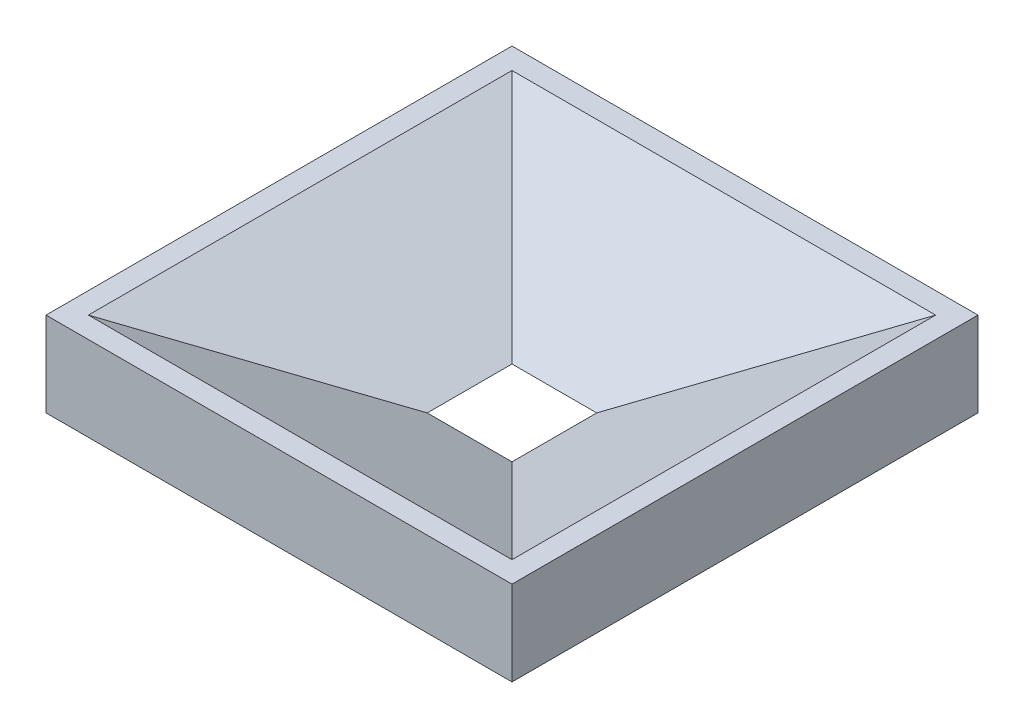
ISO-10303-21;
HEADER;
FILE_DESCRIPTION(('STEP AP214'),'2;1');
FILE_NAME('part.step','',(''),(''),'','','');
FILE_SCHEMA(('AUTOMOTIVE_DESIGN { 1 0 10303 214 1 1 1 1 }'));
ENDSEC;
DATA;
#1=APPLICATION_CONTEXT('core data for automotive mechanical design processes');
#2=APPLICATION_PROTOCOL_DEFINITION('international standard','automotive_design',2000,#1);
#3=PRODUCT_CONTEXT('',#1,'mechanical');
#4=PRODUCT('Part','Part','',(#3));
#5=PRODUCT_RELATED_PRODUCT_CATEGORY('part','',(#4));
#6=PRODUCT_DEFINITION_FORMATION('','',#4);
#7=PRODUCT_DEFINITION_CONTEXT('part definition',#1,'design');
#8=PRODUCT_DEFINITION('design','',#6,#7);
#9=PRODUCT_DEFINITION_SHAPE('','',#8);
#10=(LENGTH_UNIT() NAMED_UNIT(*) SI_UNIT(.MILLI.,.METRE.));
#11=(NAMED_UNIT(*) PLANE_ANGLE_UNIT() SI_UNIT($,.RADIAN.));
#12=(NAMED_UNIT(*) SI_UNIT($,.STERADIAN.) SOLID_ANGLE_UNIT());
#13=UNCERTAINTY_MEASURE_WITH_UNIT(LENGTH_MEASURE(1.E-05),#10,'distance_accuracy_value','');
#14=(GEOMETRIC_REPRESENTATION_CONTEXT(3) GLOBAL_UNCERTAINTY_ASSIGNED_CONTEXT((#13)) GLOBAL_UNIT_ASSIGNED_CONTEXT((#10,
#11,#12)) REPRESENTATION_CONTEXT('',''));
#15=CARTESIAN_POINT('',(0.,0.,0.));
#16=DIRECTION('',(0.,0.,1.));
#17=DIRECTION('',(1.,0.,0.));
#18=AXIS2_PLACEMENT_3D('',#15,#16,#17);
#19=CARTESIAN_POINT('',(4.99999999999999,20.,39.7213595499958));
#20=DIRECTION('',(-0.447213595499958,-0.894427190999916,0.));
#21=DIRECTION('',(0.894427190999916,-0.447213595499958,0.));
#22=AXIS2_PLACEMENT_3D('',#19,#20,#21);
#23=PLANE('',#22);
#24=DIRECTION('',(0.666666666666667,-0.333333333333333,0.666666666666667));
#25=VECTOR('',#24,1.);
#26=CARTESIAN_POINT('',(69.3206042444426,-12.1603021222213,-40.6793957555574));
#27=LINE('',#26,#25);
#28=CARTESIAN_POINT('',(4.99999999999998,20.,-105.));
#29=VERTEX_POINT('',#28);
#30=CARTESIAN_POINT('',(45.,0.,-65.));
#31=VERTEX_POINT('',#30);
#32=EDGE_CURVE('E115',#29,#31,#27,.T.);
#33=ORIENTED_EDGE('',*,*,#32,.F.);
#34=DIRECTION('',(0.,0.,1.));
#35=VECTOR('',#34,1.);
#36=CARTESIAN_POINT('',(4.99999999999999,20.,-4.99999999999999));
#37=LINE('',#36,#35);
#38=CARTESIAN_POINT('',(5.00000000000023,19.9999999999999,-4.99999999999999));
#39=VERTEX_POINT('',#38);
#40=EDGE_CURVE('E128',#29,#39,#37,.T.);
#41=ORIENTED_EDGE('',*,*,#40,.T.);
#42=DIRECTION('',(-0.666666666666667,0.333333333333333,0.666666666666667));
#43=VECTOR('',#42,1.);
#44=CARTESIAN_POINT('',(-14.8761597999981,29.9380798999991,14.8761597999981));
#45=LINE('',#44,#43);
#46=CARTESIAN_POINT('',(45.,0.,-45.));
#47=VERTEX_POINT('',#46);
#48=EDGE_CURVE('E196',#47,#39,#45,.T.);
#49=ORIENTED_EDGE('',*,*,#48,.F.);
#50=DIRECTION('',(0.,0.,-1.));
#51=VECTOR('',#50,1.);
#52=CARTESIAN_POINT('',(45.,0.,39.7213595499958));
#53=LINE('',#52,#51);
#54=EDGE_CURVE('E123',#47,#31,#53,.T.);
#55=ORIENTED_EDGE('',*,*,#54,.T.);
#56=EDGE_LOOP('',(#33,#41,#49,#55));
#57=FACE_BOUND('',#56,.T.);
#58=ADVANCED_FACE('F33',(#57),#23,.F.);
#59=CARTESIAN_POINT('',(105.,20.,39.7213595499958));
#60=DIRECTION('',(0.447213595499958,-0.894427190999916,0.));
#61=DIRECTION('',(0.894427190999916,0.447213595499958,0.));
#62=AXIS2_PLACEMENT_3D('',#59,#60,#61);
#63=PLANE('',#62);
#64=DIRECTION('',(0.666666666666667,0.333333333333333,-0.666666666666667));
#65=VECTOR('',#64,1.);
#66=CARTESIAN_POINT('',(40.6793957555574,-12.1603021222213,-40.6793957555574));
#67=LINE('',#66,#65);
#68=CARTESIAN_POINT('',(65.,0.,-65.));
#69=VERTEX_POINT('',#68);
#70=CARTESIAN_POINT('',(105.,20.,-105.));
#71=VERTEX_POINT('',#70);
#72=EDGE_CURVE('E105',#69,#71,#67,.T.);
#73=ORIENTED_EDGE('',*,*,#72,.F.);
#74=DIRECTION('',(0.,0.,-1.));
#75=VECTOR('',#74,1.);
#76=CARTESIAN_POINT('',(65.,0.,39.7213595499958));
#77=LINE('',#76,#75);
#78=CARTESIAN_POINT('',(65.,0.,-45.));
#79=VERTEX_POINT('',#78);
#80=EDGE_CURVE('E194',#79,#69,#77,.T.);
#81=ORIENTED_EDGE('',*,*,#80,.F.);
#82=DIRECTION('',(-0.666666666666667,-0.333333333333333,-0.666666666666667));
#83=VECTOR('',#82,1.);
#84=CARTESIAN_POINT('',(124.876159799998,29.9380798999991,14.8761597999981));
#85=LINE('',#84,#83);
#86=CARTESIAN_POINT('',(105.,20.,-4.99999999999999));
#87=VERTEX_POINT('',#86);
#88=EDGE_CURVE('E11',#87,#79,#85,.T.);
#89=ORIENTED_EDGE('',*,*,#88,.F.);
#90=DIRECTION('',(0.,0.,-1.));
#91=VECTOR('',#90,1.);
#92=CARTESIAN_POINT('',(105.,20.,-4.99999999999999));
#93=LINE('',#92,#91);
#94=EDGE_CURVE('E119',#87,#71,#93,.T.);
#95=ORIENTED_EDGE('',*,*,#94,.T.);
#96=EDGE_LOOP('',(#73,#81,#89,#95));
#97=FACE_BOUND('',#96,.T.);
#98=ADVANCED_FACE('F120',(#97),#63,.F.);
#99=CARTESIAN_POINT('',(0.,20.,0.));
#100=DIRECTION('',(0.,-1.,0.));
#101=DIRECTION('',(0.,0.,-1.));
#102=AXIS2_PLACEMENT_3D('',#99,#100,#101);
#103=PLANE('',#102);
#104=DIRECTION('',(-1.,0.,0.));
#105=VECTOR('',#104,1.);
#106=CARTESIAN_POINT('',(4.99999999999999,20.,-105.));
#107=LINE('',#106,#105);
#108=EDGE_CURVE('E109',#71,#29,#107,.T.);
#109=ORIENTED_EDGE('',*,*,#108,.F.);
#110=ORIENTED_EDGE('',*,*,#94,.F.);
#111=DIRECTION('',(1.,0.,0.));
#112=VECTOR('',#111,1.);
#113=CARTESIAN_POINT('',(4.99999999999999,20.,-4.99999999999999));
#114=LINE('',#113,#112);
#115=EDGE_CURVE('E130',#39,#87,#114,.T.);
#116=ORIENTED_EDGE('',*,*,#115,.F.);
#117=ORIENTED_EDGE('',*,*,#40,.F.);
#118=EDGE_LOOP('',(#109,#110,#116,#117));
#119=FACE_BOUND('',#118,.T.);
#120=DIRECTION('',(0.,0.,-1.));
#121=VECTOR('',#120,1.);
#122=CARTESIAN_POINT('',(110.,20.,0.));
#123=LINE('',#122,#121);
#124=CARTESIAN_POINT('',(110.,20.,0.));
#125=VERTEX_POINT('',#124);
#126=CARTESIAN_POINT('',(110.,20.,-110.));
#127=VERTEX_POINT('',#126);
#128=EDGE_CURVE('E139',#125,#127,#123,.T.);
#129=ORIENTED_EDGE('',*,*,#128,.T.);
#130=DIRECTION('',(-1.,0.,0.));
#131=VECTOR('',#130,1.);
#132=CARTESIAN_POINT('',(0.,20.,-110.));
#133=LINE('',#132,#131);
#134=CARTESIAN_POINT('',(0.,20.,-110.));
#135=VERTEX_POINT('',#134);
#136=EDGE_CURVE('E56',#127,#135,#133,.T.);
#137=ORIENTED_EDGE('',*,*,#136,.T.);
#138=DIRECTION('',(0.,0.,1.));
#139=VECTOR('',#138,1.);
#140=CARTESIAN_POINT('',(0.,20.,0.));
#141=LINE('',#140,#139);
#142=CARTESIAN_POINT('',(0.,20.,0.));
#143=VERTEX_POINT('',#142);
#144=EDGE_CURVE('E82',#135,#143,#141,.T.);
#145=ORIENTED_EDGE('',*,*,#144,.T.);
#146=DIRECTION('',(1.,0.,0.));
#147=VECTOR('',#146,1.);
#148=CARTESIAN_POINT('',(0.,20.,0.));
#149=LINE('',#148,#147);
#150=EDGE_CURVE('E137',#143,#125,#149,.T.);
#151=ORIENTED_EDGE('',*,*,#150,.T.);
#152=EDGE_LOOP('',(#129,#137,#145,#151));
#153=FACE_BOUND('',#152,.T.);
#154=ADVANCED_FACE('F126',(#119,#153),#103,.F.);
#155=CARTESIAN_POINT('',(0.,0.,0.));
#156=DIRECTION('',(0.,-1.,0.));
#157=DIRECTION('',(0.,0.,-1.));
#158=AXIS2_PLACEMENT_3D('',#155,#156,#157);
#159=PLANE('',#158);
#160=ORIENTED_EDGE('',*,*,#80,.T.);
#161=DIRECTION('',(-1.,0.,0.));
#162=VECTOR('',#161,1.);
#163=CARTESIAN_POINT('',(154.721359549996,0.,-65.));
#164=LINE('',#163,#162);
#165=EDGE_CURVE('E112',#69,#31,#164,.T.);
#166=ORIENTED_EDGE('',*,*,#165,.T.);
#167=ORIENTED_EDGE('',*,*,#54,.F.);
#168=DIRECTION('',(-1.,0.,0.));
#169=VECTOR('',#168,1.);
#170=CARTESIAN_POINT('',(154.721359549996,0.,-45.));
#171=LINE('',#170,#169);
#172=EDGE_CURVE('E48',#79,#47,#171,.T.);
#173=ORIENTED_EDGE('',*,*,#172,.F.);
#174=EDGE_LOOP('',(#160,#166,#167,#173));
#175=FACE_BOUND('',#174,.T.);
#176=DIRECTION('',(-1.,0.,0.));
#177=VECTOR('',#176,1.);
#178=CARTESIAN_POINT('',(0.,0.,-110.));
#179=LINE('',#178,#177);
#180=CARTESIAN_POINT('',(110.,0.,-110.));
#181=VERTEX_POINT('',#180);
#182=CARTESIAN_POINT('',(0.,0.,-110.));
#183=VERTEX_POINT('',#182);
#184=EDGE_CURVE('E77',#181,#183,#179,.T.);
#185=ORIENTED_EDGE('',*,*,#184,.F.);
#186=DIRECTION('',(0.,0.,-1.));
#187=VECTOR('',#186,1.);
#188=CARTESIAN_POINT('',(110.,0.,0.));
#189=LINE('',#188,#187);
#190=CARTESIAN_POINT('',(110.,0.,0.));
#191=VERTEX_POINT('',#190);
#192=EDGE_CURVE('E146',#191,#181,#189,.T.);
#193=ORIENTED_EDGE('',*,*,#192,.F.);
#194=DIRECTION('',(1.,0.,0.));
#195=VECTOR('',#194,1.);
#196=CARTESIAN_POINT('',(0.,0.,0.));
#197=LINE('',#196,#195);
#198=CARTESIAN_POINT('',(0.,0.,0.));
#199=VERTEX_POINT('',#198);
#200=EDGE_CURVE('E144',#199,#191,#197,.T.);
#201=ORIENTED_EDGE('',*,*,#200,.F.);
#202=DIRECTION('',(0.,0.,1.));
#203=VECTOR('',#202,1.);
#204=CARTESIAN_POINT('',(0.,0.,0.));
#205=LINE('',#204,#203);
#206=EDGE_CURVE('E135',#183,#199,#205,.T.);
#207=ORIENTED_EDGE('',*,*,#206,.F.);
#208=EDGE_LOOP('',(#185,#193,#201,#207));
#209=FACE_BOUND('',#208,.T.);
#210=ADVANCED_FACE('F164',(#175,#209),#159,.T.);
#211=CARTESIAN_POINT('',(0.,20.,0.));
#212=DIRECTION('',(1.,0.,0.));
#213=DIRECTION('',(0.,0.,-1.));
#214=AXIS2_PLACEMENT_3D('',#211,#212,#213);
#215=PLANE('',#214);
#216=ORIENTED_EDGE('',*,*,#206,.T.);
#217=DIRECTION('',(0.,-1.,0.));
#218=VECTOR('',#217,1.);
#219=CARTESIAN_POINT('',(0.,20.,0.));
#220=LINE('',#219,#218);
#221=EDGE_CURVE('E41',#143,#199,#220,.T.);
#222=ORIENTED_EDGE('',*,*,#221,.F.);
#223=ORIENTED_EDGE('',*,*,#144,.F.);
#224=DIRECTION('',(0.,-1.,0.));
#225=VECTOR('',#224,1.);
#226=CARTESIAN_POINT('',(0.,20.,-110.));
#227=LINE('',#226,#225);
#228=EDGE_CURVE('E142',#135,#183,#227,.T.);
#229=ORIENTED_EDGE('',*,*,#228,.T.);
#230=EDGE_LOOP('',(#216,#222,#223,#229));
#231=FACE_BOUND('',#230,.T.);
#232=ADVANCED_FACE('F35',(#231),#215,.F.);
#233=CARTESIAN_POINT('',(0.,20.,0.));
#234=DIRECTION('',(0.,0.,-1.));
#235=DIRECTION('',(-1.,0.,0.));
#236=AXIS2_PLACEMENT_3D('',#233,#234,#235);
#237=PLANE('',#236);
#238=ORIENTED_EDGE('',*,*,#200,.T.);
#239=DIRECTION('',(0.,-1.,0.));
#240=VECTOR('',#239,1.);
#241=CARTESIAN_POINT('',(110.,20.,0.));
#242=LINE('',#241,#240);
#243=EDGE_CURVE('E152',#125,#191,#242,.T.);
#244=ORIENTED_EDGE('',*,*,#243,.F.);
#245=ORIENTED_EDGE('',*,*,#150,.F.);
#246=ORIENTED_EDGE('',*,*,#221,.T.);
#247=EDGE_LOOP('',(#238,#244,#245,#246));
#248=FACE_BOUND('',#247,.T.);
#249=ADVANCED_FACE('F157',(#248),#237,.F.);
#250=CARTESIAN_POINT('',(110.,20.,0.));
#251=DIRECTION('',(-1.,0.,0.));
#252=DIRECTION('',(0.,0.,1.));
#253=AXIS2_PLACEMENT_3D('',#250,#251,#252);
#254=PLANE('',#253);
#255=ORIENTED_EDGE('',*,*,#192,.T.);
#256=DIRECTION('',(0.,-1.,0.));
#257=VECTOR('',#256,1.);
#258=CARTESIAN_POINT('',(110.,20.,-110.));
#259=LINE('',#258,#257);
#260=EDGE_CURVE('E150',#127,#181,#259,.T.);
#261=ORIENTED_EDGE('',*,*,#260,.F.);
#262=ORIENTED_EDGE('',*,*,#128,.F.);
#263=ORIENTED_EDGE('',*,*,#243,.T.);
#264=EDGE_LOOP('',(#255,#261,#262,#263));
#265=FACE_BOUND('',#264,.T.);
#266=ADVANCED_FACE('F167',(#265),#254,.F.);
#267=CARTESIAN_POINT('',(0.,20.,-110.));
#268=DIRECTION('',(0.,0.,1.));
#269=DIRECTION('',(1.,0.,0.));
#270=AXIS2_PLACEMENT_3D('',#267,#268,#269);
#271=PLANE('',#270);
#272=ORIENTED_EDGE('',*,*,#184,.T.);
#273=ORIENTED_EDGE('',*,*,#228,.F.);
#274=ORIENTED_EDGE('',*,*,#136,.F.);
#275=ORIENTED_EDGE('',*,*,#260,.T.);
#276=EDGE_LOOP('',(#272,#273,#274,#275));
#277=FACE_BOUND('',#276,.T.);
#278=ADVANCED_FACE('F169',(#277),#271,.F.);
#279=CARTESIAN_POINT('',(154.721359549996,20.,-4.99999999999999));
#280=DIRECTION('',(0.,-0.894427190999916,0.447213595499958));
#281=DIRECTION('',(0.,-0.447213595499958,-0.894427190999916));
#282=AXIS2_PLACEMENT_3D('',#279,#280,#281);
#283=PLANE('',#282);
#284=ORIENTED_EDGE('',*,*,#172,.T.);
#285=ORIENTED_EDGE('',*,*,#48,.T.);
#286=ORIENTED_EDGE('',*,*,#115,.T.);
#287=ORIENTED_EDGE('',*,*,#88,.T.);
#288=EDGE_LOOP('',(#284,#285,#286,#287));
#289=FACE_BOUND('',#288,.T.);
#290=ADVANCED_FACE('F171',(#289),#283,.F.);
#291=CARTESIAN_POINT('',(154.721359549996,20.,-105.));
#292=DIRECTION('',(0.,-0.894427190999916,-0.447213595499958));
#293=DIRECTION('',(0.,0.447213595499958,-0.894427190999916));
#294=AXIS2_PLACEMENT_3D('',#291,#292,#293);
#295=PLANE('',#294);
#296=ORIENTED_EDGE('',*,*,#108,.T.);
#297=ORIENTED_EDGE('',*,*,#32,.T.);
#298=ORIENTED_EDGE('',*,*,#165,.F.);
#299=ORIENTED_EDGE('',*,*,#72,.T.);
#300=EDGE_LOOP('',(#296,#297,#298,#299));
#301=FACE_BOUND('',#300,.T.);
#302=ADVANCED_FACE('F107',(#301),#295,.F.);
#303=CLOSED_SHELL('',(#58,#98,#154,#210,#232,#249,#266,#278,#290,#302));
#304=MANIFOLD_SOLID_BREP('B2',#303);
#305=ADVANCED_BREP_SHAPE_REPRESENTATION('',(#18,#304),#14);
#306=SHAPE_DEFINITION_REPRESENTATION(#9,#305);
ENDSEC;
END-ISO-10303-21;
